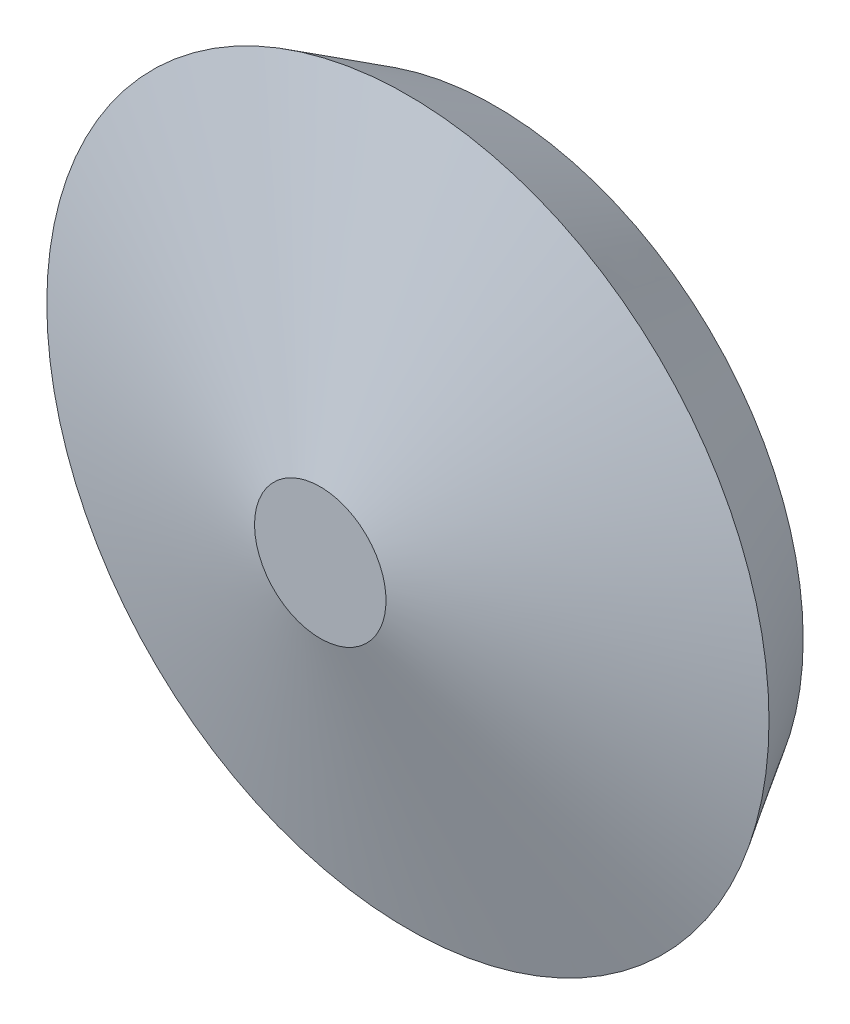
ISO-10303-21;
HEADER;
FILE_DESCRIPTION(('STEP AP214'),'2;1');
FILE_NAME('part.step','',(''),(''),'','','');
FILE_SCHEMA(('AUTOMOTIVE_DESIGN { 1 0 10303 214 1 1 1 1 }'));
ENDSEC;
DATA;
#1=APPLICATION_CONTEXT('core data for automotive mechanical design processes');
#2=APPLICATION_PROTOCOL_DEFINITION('international standard','automotive_design',2000,#1);
#3=PRODUCT_CONTEXT('',#1,'mechanical');
#4=PRODUCT('Part','Part','',(#3));
#5=PRODUCT_RELATED_PRODUCT_CATEGORY('part','',(#4));
#6=PRODUCT_DEFINITION_FORMATION('','',#4);
#7=PRODUCT_DEFINITION_CONTEXT('part definition',#1,'design');
#8=PRODUCT_DEFINITION('design','',#6,#7);
#9=PRODUCT_DEFINITION_SHAPE('','',#8);
#10=(LENGTH_UNIT() NAMED_UNIT(*) SI_UNIT(.MILLI.,.METRE.));
#11=(NAMED_UNIT(*) PLANE_ANGLE_UNIT() SI_UNIT($,.RADIAN.));
#12=(NAMED_UNIT(*) SI_UNIT($,.STERADIAN.) SOLID_ANGLE_UNIT());
#13=UNCERTAINTY_MEASURE_WITH_UNIT(LENGTH_MEASURE(1.E-05),#10,'distance_accuracy_value','');
#14=(GEOMETRIC_REPRESENTATION_CONTEXT(3) GLOBAL_UNCERTAINTY_ASSIGNED_CONTEXT((#13)) GLOBAL_UNIT_ASSIGNED_CONTEXT((#10,
#11,#12)) REPRESENTATION_CONTEXT('',''));
#15=CARTESIAN_POINT('',(0.,0.,0.));
#16=DIRECTION('',(0.,0.,1.));
#17=DIRECTION('',(1.,0.,0.));
#18=AXIS2_PLACEMENT_3D('',#15,#16,#17);
#19=CARTESIAN_POINT('',(0.,0.,0.));
#20=DIRECTION('',(0.,0.,1.));
#21=DIRECTION('',(1.,0.,0.));
#22=AXIS2_PLACEMENT_3D('',#19,#20,#21);
#23=PLANE('',#22);
#24=CARTESIAN_POINT('',(0.,0.,0.));
#25=DIRECTION('',(0.,0.,1.));
#26=DIRECTION('',(1.,0.,0.));
#27=AXIS2_PLACEMENT_3D('',#24,#25,#26);
#28=CIRCLE('',#27,175.5);
#29=CARTESIAN_POINT('',(175.5,0.,0.));
#30=VERTEX_POINT('',#29);
#31=EDGE_CURVE('E51',#30,#30,#28,.T.);
#32=ORIENTED_EDGE('',*,*,#31,.F.);
#33=EDGE_LOOP('',(#32));
#34=FACE_BOUND('',#33,.T.);
#35=ADVANCED_FACE('F43',(#34),#23,.F.);
#36=CARTESIAN_POINT('',(0.,0.,0.));
#37=DIRECTION('',(0.,0.,1.));
#38=DIRECTION('',(1.,0.,0.));
#39=AXIS2_PLACEMENT_3D('',#36,#37,#38);
#40=CONICAL_SURFACE('',#39,175.5,0.547740013715902);
#41=ORIENTED_EDGE('',*,*,#31,.T.);
#42=EDGE_LOOP('',(#41));
#43=FACE_BOUND('',#42,.T.);
#44=CARTESIAN_POINT('',(0.,0.,50.));
#45=DIRECTION('',(0.,0.,1.));
#46=DIRECTION('',(1.,0.,0.));
#47=AXIS2_PLACEMENT_3D('',#44,#45,#46);
#48=CIRCLE('',#47,206.);
#49=CARTESIAN_POINT('',(-206.,0.,50.));
#50=VERTEX_POINT('',#49);
#51=EDGE_CURVE('E11',#50,#50,#48,.T.);
#52=ORIENTED_EDGE('',*,*,#51,.F.);
#53=EDGE_LOOP('',(#52));
#54=FACE_BOUND('',#53,.T.);
#55=ADVANCED_FACE('F45',(#43,#54),#40,.T.);
#56=CARTESIAN_POINT('',(0.,0.,100.));
#57=DIRECTION('',(0.,0.,1.));
#58=DIRECTION('',(1.,0.,0.));
#59=AXIS2_PLACEMENT_3D('',#56,#57,#58);
#60=PLANE('',#59);
#61=CARTESIAN_POINT('',(0.,0.,100.));
#62=DIRECTION('',(0.,0.,1.));
#63=DIRECTION('',(1.,0.,0.));
#64=AXIS2_PLACEMENT_3D('',#61,#62,#63);
#65=CIRCLE('',#64,37.5);
#66=CARTESIAN_POINT('',(-37.5,0.,100.));
#67=VERTEX_POINT('',#66);
#68=EDGE_CURVE('E55',#67,#67,#65,.T.);
#69=ORIENTED_EDGE('',*,*,#68,.T.);
#70=EDGE_LOOP('',(#69));
#71=FACE_BOUND('',#70,.T.);
#72=ADVANCED_FACE('F81',(#71),#60,.T.);
#73=CARTESIAN_POINT('',(0.,0.,100.));
#74=DIRECTION('',(0.,0.,-1.));
#75=DIRECTION('',(-1.,0.,0.));
#76=AXIS2_PLACEMENT_3D('',#73,#74,#75);
#77=CONICAL_SURFACE('',#76,37.5,1.28233679854594);
#78=CARTESIAN_POINT('',(-37.5,0.,100.));
#79=CARTESIAN_POINT('',(-39.2552083333333,0.,99.4791666666667));
#80=CARTESIAN_POINT('',(-41.0104166666667,0.,98.9583333333333));
#81=CARTESIAN_POINT('',(-44.5208333333333,0.,97.9166666666667));
#82=CARTESIAN_POINT('',(-46.2760416666667,0.,97.3958333333333));
#83=CARTESIAN_POINT('',(-49.7864583333333,0.,96.3541666666667));
#84=CARTESIAN_POINT('',(-51.5416666666667,0.,95.8333333333333));
#85=CARTESIAN_POINT('',(-55.0520833333333,0.,94.7916666666667));
#86=CARTESIAN_POINT('',(-56.8072916666667,0.,94.2708333333333));
#87=CARTESIAN_POINT('',(-60.3177083333333,0.,93.2291666666667));
#88=CARTESIAN_POINT('',(-62.0729166666667,0.,92.7083333333333));
#89=CARTESIAN_POINT('',(-65.5833333333333,0.,91.6666666666667));
#90=CARTESIAN_POINT('',(-67.3385416666667,0.,91.1458333333333));
#91=CARTESIAN_POINT('',(-70.8489583333333,0.,90.1041666666667));
#92=CARTESIAN_POINT('',(-72.6041666666667,0.,89.5833333333333));
#93=CARTESIAN_POINT('',(-76.1145833333333,0.,88.5416666666667));
#94=CARTESIAN_POINT('',(-77.8697916666667,0.,88.0208333333333));
#95=CARTESIAN_POINT('',(-81.3802083333333,0.,86.9791666666667));
#96=CARTESIAN_POINT('',(-83.1354166666667,0.,86.4583333333333));
#97=CARTESIAN_POINT('',(-86.6458333333333,0.,85.4166666666667));
#98=CARTESIAN_POINT('',(-88.4010416666667,0.,84.8958333333333));
#99=CARTESIAN_POINT('',(-91.9114583333333,0.,83.8541666666667));
#100=CARTESIAN_POINT('',(-93.6666666666667,0.,83.3333333333333));
#101=CARTESIAN_POINT('',(-97.1770833333333,0.,82.2916666666667));
#102=CARTESIAN_POINT('',(-98.9322916666667,0.,81.7708333333333));
#103=CARTESIAN_POINT('',(-102.442708333333,0.,80.7291666666667));
#104=CARTESIAN_POINT('',(-104.197916666667,0.,80.2083333333333));
#105=CARTESIAN_POINT('',(-107.708333333333,0.,79.1666666666667));
#106=CARTESIAN_POINT('',(-109.463541666667,0.,78.6458333333333));
#107=CARTESIAN_POINT('',(-112.973958333333,0.,77.6041666666667));
#108=CARTESIAN_POINT('',(-114.729166666667,0.,77.0833333333333));
#109=CARTESIAN_POINT('',(-118.239583333333,0.,76.0416666666667));
#110=CARTESIAN_POINT('',(-119.994791666667,0.,75.5208333333333));
#111=CARTESIAN_POINT('',(-123.505208333333,0.,74.4791666666667));
#112=CARTESIAN_POINT('',(-125.260416666667,0.,73.9583333333333));
#113=CARTESIAN_POINT('',(-128.770833333333,0.,72.9166666666667));
#114=CARTESIAN_POINT('',(-130.526041666667,0.,72.3958333333333));
#115=CARTESIAN_POINT('',(-134.036458333333,0.,71.3541666666667));
#116=CARTESIAN_POINT('',(-135.791666666667,0.,70.8333333333333));
#117=CARTESIAN_POINT('',(-139.302083333333,0.,69.7916666666667));
#118=CARTESIAN_POINT('',(-141.057291666667,0.,69.2708333333333));
#119=CARTESIAN_POINT('',(-144.567708333333,0.,68.2291666666667));
#120=CARTESIAN_POINT('',(-146.322916666667,0.,67.7083333333333));
#121=CARTESIAN_POINT('',(-149.833333333333,0.,66.6666666666667));
#122=CARTESIAN_POINT('',(-151.588541666667,0.,66.1458333333333));
#123=CARTESIAN_POINT('',(-155.098958333333,0.,65.1041666666667));
#124=CARTESIAN_POINT('',(-156.854166666667,0.,64.5833333333333));
#125=CARTESIAN_POINT('',(-160.364583333333,0.,63.5416666666667));
#126=CARTESIAN_POINT('',(-162.119791666667,0.,63.0208333333333));
#127=CARTESIAN_POINT('',(-165.630208333333,0.,61.9791666666667));
#128=CARTESIAN_POINT('',(-167.385416666667,0.,61.4583333333333));
#129=CARTESIAN_POINT('',(-170.895833333333,0.,60.4166666666667));
#130=CARTESIAN_POINT('',(-172.651041666667,0.,59.8958333333333));
#131=CARTESIAN_POINT('',(-176.161458333333,0.,58.8541666666667));
#132=CARTESIAN_POINT('',(-177.916666666667,0.,58.3333333333333));
#133=CARTESIAN_POINT('',(-181.427083333333,0.,57.2916666666667));
#134=CARTESIAN_POINT('',(-183.182291666667,0.,56.7708333333333));
#135=CARTESIAN_POINT('',(-186.692708333333,0.,55.7291666666667));
#136=CARTESIAN_POINT('',(-188.447916666667,0.,55.2083333333333));
#137=CARTESIAN_POINT('',(-191.958333333333,0.,54.1666666666667));
#138=CARTESIAN_POINT('',(-193.713541666667,0.,53.6458333333333));
#139=CARTESIAN_POINT('',(-197.223958333333,0.,52.6041666666667));
#140=CARTESIAN_POINT('',(-198.979166666667,0.,52.0833333333333));
#141=CARTESIAN_POINT('',(-202.489583333333,0.,51.0416666666667));
#142=CARTESIAN_POINT('',(-204.244791666667,0.,50.5208333333333));
#143=CARTESIAN_POINT('',(-206.,0.,50.));
#144=B_SPLINE_CURVE_WITH_KNOTS('',3,(#78,#79,#80,#81,#82,#83,#84,#85,#86,#87,#88,#89,#90,#91,
#92,#93,#94,#95,#96,#97,#98,#99,#100,#101,#102,#103,#104,#105,#106,#107,#108,#109,#110,#111,
#112,#113,#114,#115,#116,#117,#118,#119,#120,#121,#122,#123,#124,#125,#126,#127,#128,#129,#130,
#131,#132,#133,#134,#135,#136,#137,#138,#139,#140,#141,#142,#143),.UNSPECIFIED.,.F.,.F.,(4,2,2,
2,2,2,2,2,2,2,2,2,2,2,2,2,2,2,2,2,2,2,2,2,2,2,2,2,2,2,2,2,4),(0.,5.49255977578988,
10.9851195515798,16.4776793273696,21.9702391031595,27.4627988789494,32.9553586547393,
38.4479184305292,43.940478206319,49.4330379821089,54.9255977578988,60.4181575336887,
65.9107173094786,71.4032770852684,76.8958368610583,82.3883966368482,87.8809564126381,
93.373516188428,98.8660759642178,104.358635740008,109.851195515798,115.343755291587,
120.836315067377,126.328874843167,131.821434618957,137.313994394747,142.806554170537,
148.299113946327,153.791673722117,159.284233497907,164.776793273696,170.269353049486,
175.761912825276),.UNSPECIFIED.);
#145=EDGE_CURVE('BSEAM77',#67,#50,#144,.T.);
#146=ORIENTED_EDGE('',*,*,#68,.F.);
#147=ORIENTED_EDGE('',*,*,#51,.T.);
#148=ORIENTED_EDGE('',*,*,#145,.T.);
#149=ORIENTED_EDGE('',*,*,#145,.F.);
#150=EDGE_LOOP('',(#146,#148,#147,#149));
#151=FACE_BOUND('',#150,.T.);
#152=ADVANCED_FACE('F77',(#151),#77,.T.);
#153=CLOSED_SHELL('',(#35,#55,#72,#152));
#154=MANIFOLD_SOLID_BREP('B2',#153);
#155=ADVANCED_BREP_SHAPE_REPRESENTATION('',(#18,#154),#14);
#156=SHAPE_DEFINITION_REPRESENTATION(#9,#155);
ENDSEC;
END-ISO-10303-21;
